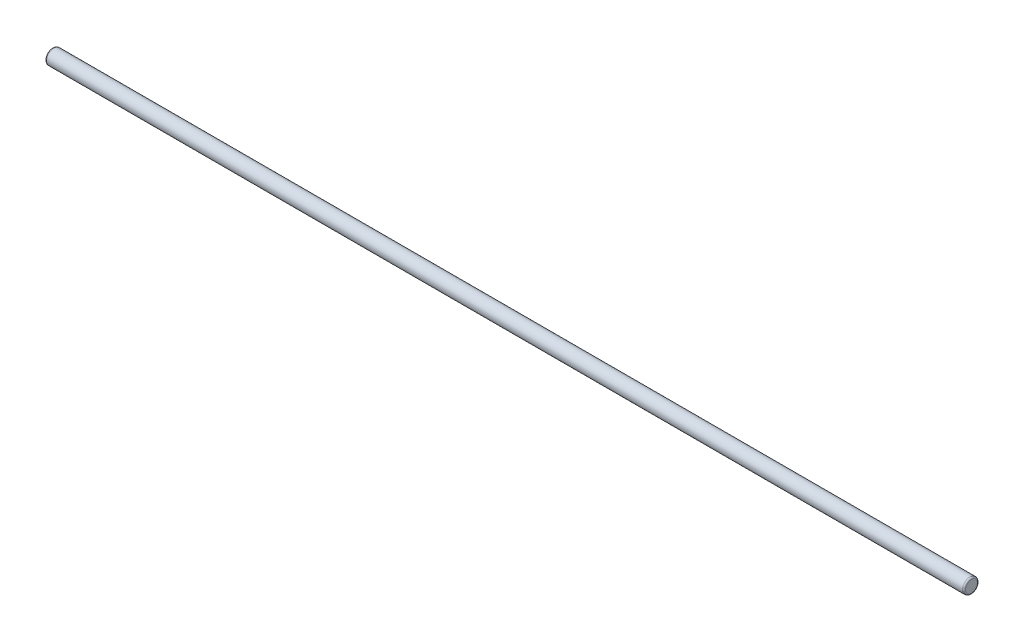
ISO-10303-21;
HEADER;
FILE_DESCRIPTION(('STEP AP214'),'2;1');
FILE_NAME('part.step','',(''),(''),'','','');
FILE_SCHEMA(('AUTOMOTIVE_DESIGN { 1 0 10303 214 1 1 1 1 }'));
ENDSEC;
DATA;
#1=APPLICATION_CONTEXT('core data for automotive mechanical design processes');
#2=APPLICATION_PROTOCOL_DEFINITION('international standard','automotive_design',2000,#1);
#3=PRODUCT_CONTEXT('',#1,'mechanical');
#4=PRODUCT('Part','Part','',(#3));
#5=PRODUCT_RELATED_PRODUCT_CATEGORY('part','',(#4));
#6=PRODUCT_DEFINITION_FORMATION('','',#4);
#7=PRODUCT_DEFINITION_CONTEXT('part definition',#1,'design');
#8=PRODUCT_DEFINITION('design','',#6,#7);
#9=PRODUCT_DEFINITION_SHAPE('','',#8);
#10=(LENGTH_UNIT() NAMED_UNIT(*) SI_UNIT(.MILLI.,.METRE.));
#11=(NAMED_UNIT(*) PLANE_ANGLE_UNIT() SI_UNIT($,.RADIAN.));
#12=(NAMED_UNIT(*) SI_UNIT($,.STERADIAN.) SOLID_ANGLE_UNIT());
#13=UNCERTAINTY_MEASURE_WITH_UNIT(LENGTH_MEASURE(1.E-05),#10,'distance_accuracy_value','');
#14=(GEOMETRIC_REPRESENTATION_CONTEXT(3) GLOBAL_UNCERTAINTY_ASSIGNED_CONTEXT((#13)) GLOBAL_UNIT_ASSIGNED_CONTEXT((#10,
#11,#12)) REPRESENTATION_CONTEXT('',''));
#15=CARTESIAN_POINT('',(0.,0.,0.));
#16=DIRECTION('',(0.,0.,1.));
#17=DIRECTION('',(1.,0.,0.));
#18=AXIS2_PLACEMENT_3D('',#15,#16,#17);
#19=CARTESIAN_POINT('',(310.,0.,0.));
#20=DIRECTION('',(-1.,0.,0.));
#21=DIRECTION('',(0.,0.,1.));
#22=AXIS2_PLACEMENT_3D('',#19,#20,#21);
#23=CYLINDRICAL_SURFACE('',#22,5.);
#24=CARTESIAN_POINT('',(-309.,0.,0.));
#25=DIRECTION('',(1.,0.,0.));
#26=DIRECTION('',(0.,0.,-1.));
#27=AXIS2_PLACEMENT_3D('',#24,#25,#26);
#28=CIRCLE('',#27,5.);
#29=CARTESIAN_POINT('',(-309.,0.,-5.));
#30=VERTEX_POINT('',#29);
#31=EDGE_CURVE('E49',#30,#30,#28,.T.);
#32=ORIENTED_EDGE('',*,*,#31,.T.);
#33=EDGE_LOOP('',(#32));
#34=FACE_BOUND('',#33,.T.);
#35=CARTESIAN_POINT('',(309.,0.,0.));
#36=DIRECTION('',(1.,0.,0.));
#37=DIRECTION('',(0.,0.,-1.));
#38=AXIS2_PLACEMENT_3D('',#35,#36,#37);
#39=CIRCLE('',#38,5.);
#40=CARTESIAN_POINT('',(309.,0.,-5.));
#41=VERTEX_POINT('',#40);
#42=EDGE_CURVE('E53',#41,#41,#39,.F.);
#43=ORIENTED_EDGE('',*,*,#42,.T.);
#44=EDGE_LOOP('',(#43));
#45=FACE_BOUND('',#44,.T.);
#46=ADVANCED_FACE('F39',(#34,#45),#23,.T.);
#47=CARTESIAN_POINT('',(310.,0.,0.));
#48=DIRECTION('',(1.,0.,0.));
#49=DIRECTION('',(0.,0.,-1.));
#50=AXIS2_PLACEMENT_3D('',#47,#48,#49);
#51=PLANE('',#50);
#52=CARTESIAN_POINT('',(310.,0.,0.));
#53=DIRECTION('',(1.,0.,0.));
#54=DIRECTION('',(0.,0.,-1.));
#55=AXIS2_PLACEMENT_3D('',#52,#53,#54);
#56=CIRCLE('',#55,4.);
#57=CARTESIAN_POINT('',(310.,0.,-4.));
#58=VERTEX_POINT('',#57);
#59=EDGE_CURVE('E10',#58,#58,#56,.T.);
#60=ORIENTED_EDGE('',*,*,#59,.T.);
#61=EDGE_LOOP('',(#60));
#62=FACE_BOUND('',#61,.T.);
#63=ADVANCED_FACE('F69',(#62),#51,.T.);
#64=CARTESIAN_POINT('',(-310.,0.,0.));
#65=DIRECTION('',(1.,0.,0.));
#66=DIRECTION('',(0.,0.,-1.));
#67=AXIS2_PLACEMENT_3D('',#64,#65,#66);
#68=PLANE('',#67);
#69=CARTESIAN_POINT('',(-310.,0.,0.));
#70=DIRECTION('',(1.,0.,0.));
#71=DIRECTION('',(0.,0.,-1.));
#72=AXIS2_PLACEMENT_3D('',#69,#70,#71);
#73=CIRCLE('',#72,4.);
#74=CARTESIAN_POINT('',(-310.,0.,-4.));
#75=VERTEX_POINT('',#74);
#76=EDGE_CURVE('E46',#75,#75,#73,.F.);
#77=ORIENTED_EDGE('',*,*,#76,.T.);
#78=EDGE_LOOP('',(#77));
#79=FACE_BOUND('',#78,.T.);
#80=ADVANCED_FACE('F70',(#79),#68,.F.);
#81=CARTESIAN_POINT('',(-309.,0.,0.));
#82=DIRECTION('',(1.,0.,0.));
#83=DIRECTION('',(0.,0.,-1.));
#84=AXIS2_PLACEMENT_3D('',#81,#82,#83);
#85=TOROIDAL_SURFACE('',#84,4.,1.);
#86=ORIENTED_EDGE('',*,*,#76,.F.);
#87=EDGE_LOOP('',(#86));
#88=FACE_BOUND('',#87,.T.);
#89=ORIENTED_EDGE('',*,*,#31,.F.);
#90=EDGE_LOOP('',(#89));
#91=FACE_BOUND('',#90,.T.);
#92=ADVANCED_FACE('F65',(#88,#91),#85,.T.);
#93=CARTESIAN_POINT('',(309.,0.,0.));
#94=DIRECTION('',(1.,0.,0.));
#95=DIRECTION('',(0.,0.,-1.));
#96=AXIS2_PLACEMENT_3D('',#93,#94,#95);
#97=TOROIDAL_SURFACE('',#96,4.,1.);
#98=ORIENTED_EDGE('',*,*,#42,.F.);
#99=EDGE_LOOP('',(#98));
#100=FACE_BOUND('',#99,.T.);
#101=ORIENTED_EDGE('',*,*,#59,.F.);
#102=EDGE_LOOP('',(#101));
#103=FACE_BOUND('',#102,.T.);
#104=ADVANCED_FACE('F41',(#100,#103),#97,.T.);
#105=CLOSED_SHELL('',(#46,#63,#80,#92,#104));
#106=MANIFOLD_SOLID_BREP('B2',#105);
#107=ADVANCED_BREP_SHAPE_REPRESENTATION('',(#18,#106),#14);
#108=SHAPE_DEFINITION_REPRESENTATION(#9,#107);
ENDSEC;
END-ISO-10303-21;
